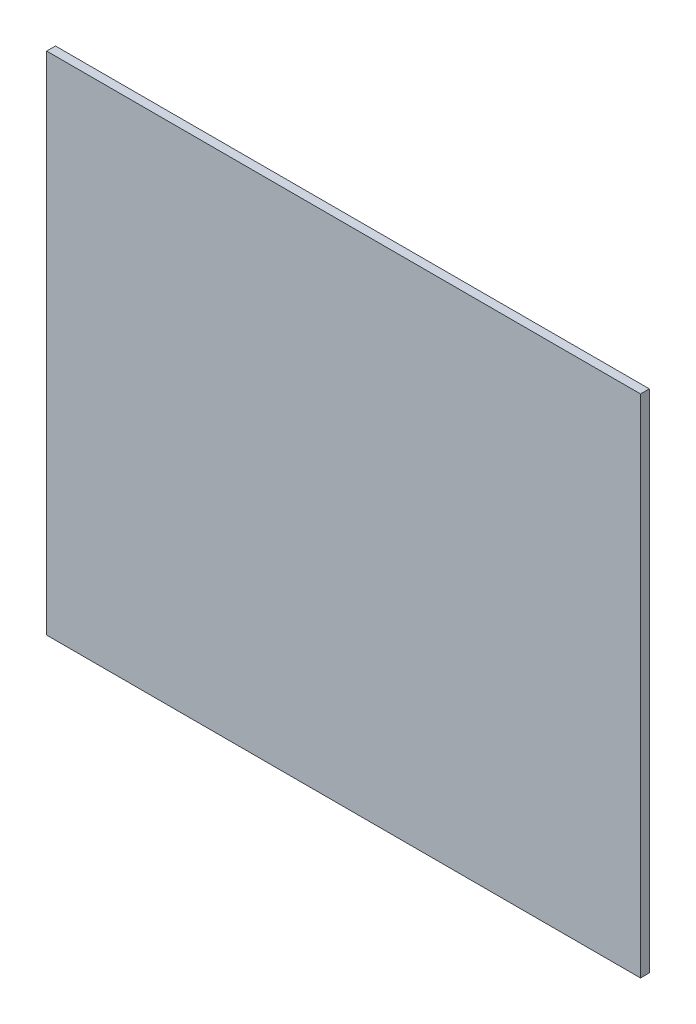
ISO-10303-21;
HEADER;
FILE_DESCRIPTION(('STEP AP214'),'2;1');
FILE_NAME('part.step','',(''),(''),'','','');
FILE_SCHEMA(('AUTOMOTIVE_DESIGN { 1 0 10303 214 1 1 1 1 }'));
ENDSEC;
DATA;
#1=APPLICATION_CONTEXT('core data for automotive mechanical design processes');
#2=APPLICATION_PROTOCOL_DEFINITION('international standard','automotive_design',2000,#1);
#3=PRODUCT_CONTEXT('',#1,'mechanical');
#4=PRODUCT('Part','Part','',(#3));
#5=PRODUCT_RELATED_PRODUCT_CATEGORY('part','',(#4));
#6=PRODUCT_DEFINITION_FORMATION('','',#4);
#7=PRODUCT_DEFINITION_CONTEXT('part definition',#1,'design');
#8=PRODUCT_DEFINITION('design','',#6,#7);
#9=PRODUCT_DEFINITION_SHAPE('','',#8);
#10=(LENGTH_UNIT() NAMED_UNIT(*) SI_UNIT(.MILLI.,.METRE.));
#11=(NAMED_UNIT(*) PLANE_ANGLE_UNIT() SI_UNIT($,.RADIAN.));
#12=(NAMED_UNIT(*) SI_UNIT($,.STERADIAN.) SOLID_ANGLE_UNIT());
#13=UNCERTAINTY_MEASURE_WITH_UNIT(LENGTH_MEASURE(1.E-05),#10,'distance_accuracy_value','');
#14=(GEOMETRIC_REPRESENTATION_CONTEXT(3) GLOBAL_UNCERTAINTY_ASSIGNED_CONTEXT((#13)) GLOBAL_UNIT_ASSIGNED_CONTEXT((#10,
#11,#12)) REPRESENTATION_CONTEXT('',''));
#15=CARTESIAN_POINT('',(0.,0.,0.));
#16=DIRECTION('',(0.,0.,1.));
#17=DIRECTION('',(1.,0.,0.));
#18=AXIS2_PLACEMENT_3D('',#15,#16,#17);
#19=CARTESIAN_POINT('',(135.,115.,4.));
#20=DIRECTION('',(-1.,0.,0.));
#21=DIRECTION('',(0.,-1.,0.));
#22=AXIS2_PLACEMENT_3D('',#19,#20,#21);
#23=PLANE('',#22);
#24=DIRECTION('',(0.,1.,0.));
#25=VECTOR('',#24,1.);
#26=CARTESIAN_POINT('',(135.,115.,0.));
#27=LINE('',#26,#25);
#28=CARTESIAN_POINT('',(135.,-115.,0.));
#29=VERTEX_POINT('',#28);
#30=CARTESIAN_POINT('',(135.,115.,0.));
#31=VERTEX_POINT('',#30);
#32=EDGE_CURVE('E96',#29,#31,#27,.T.);
#33=ORIENTED_EDGE('',*,*,#32,.T.);
#34=DIRECTION('',(0.,0.,-1.));
#35=VECTOR('',#34,1.);
#36=CARTESIAN_POINT('',(135.,115.,4.));
#37=LINE('',#36,#35);
#38=CARTESIAN_POINT('',(135.,115.,4.));
#39=VERTEX_POINT('',#38);
#40=EDGE_CURVE('E11',#39,#31,#37,.T.);
#41=ORIENTED_EDGE('',*,*,#40,.F.);
#42=DIRECTION('',(0.,1.,0.));
#43=VECTOR('',#42,1.);
#44=CARTESIAN_POINT('',(135.,115.,4.));
#45=LINE('',#44,#43);
#46=CARTESIAN_POINT('',(135.,-115.,4.));
#47=VERTEX_POINT('',#46);
#48=EDGE_CURVE('E84',#47,#39,#45,.T.);
#49=ORIENTED_EDGE('',*,*,#48,.F.);
#50=DIRECTION('',(0.,0.,-1.));
#51=VECTOR('',#50,1.);
#52=CARTESIAN_POINT('',(135.,-115.,4.));
#53=LINE('',#52,#51);
#54=EDGE_CURVE('E92',#47,#29,#53,.T.);
#55=ORIENTED_EDGE('',*,*,#54,.T.);
#56=EDGE_LOOP('',(#33,#41,#49,#55));
#57=FACE_BOUND('',#56,.T.);
#58=ADVANCED_FACE('F33',(#57),#23,.F.);
#59=CARTESIAN_POINT('',(-135.,115.,4.));
#60=DIRECTION('',(0.,-1.,0.));
#61=DIRECTION('',(0.,0.,-1.));
#62=AXIS2_PLACEMENT_3D('',#59,#60,#61);
#63=PLANE('',#62);
#64=DIRECTION('',(-1.,0.,0.));
#65=VECTOR('',#64,1.);
#66=CARTESIAN_POINT('',(-135.,115.,0.));
#67=LINE('',#66,#65);
#68=CARTESIAN_POINT('',(-135.,115.,0.));
#69=VERTEX_POINT('',#68);
#70=EDGE_CURVE('E88',#31,#69,#67,.T.);
#71=ORIENTED_EDGE('',*,*,#70,.T.);
#72=DIRECTION('',(0.,0.,-1.));
#73=VECTOR('',#72,1.);
#74=CARTESIAN_POINT('',(-135.,115.,4.));
#75=LINE('',#74,#73);
#76=CARTESIAN_POINT('',(-135.,115.,4.));
#77=VERTEX_POINT('',#76);
#78=EDGE_CURVE('E41',#77,#69,#75,.T.);
#79=ORIENTED_EDGE('',*,*,#78,.F.);
#80=DIRECTION('',(-1.,0.,0.));
#81=VECTOR('',#80,1.);
#82=CARTESIAN_POINT('',(-135.,115.,4.));
#83=LINE('',#82,#81);
#84=EDGE_CURVE('E79',#39,#77,#83,.T.);
#85=ORIENTED_EDGE('',*,*,#84,.F.);
#86=ORIENTED_EDGE('',*,*,#40,.T.);
#87=EDGE_LOOP('',(#71,#79,#85,#86));
#88=FACE_BOUND('',#87,.T.);
#89=ADVANCED_FACE('F87',(#88),#63,.F.);
#90=CARTESIAN_POINT('',(-135.,115.,4.));
#91=DIRECTION('',(1.,0.,0.));
#92=DIRECTION('',(0.,1.,0.));
#93=AXIS2_PLACEMENT_3D('',#90,#91,#92);
#94=PLANE('',#93);
#95=DIRECTION('',(0.,-1.,0.));
#96=VECTOR('',#95,1.);
#97=CARTESIAN_POINT('',(-135.,115.,0.));
#98=LINE('',#97,#96);
#99=CARTESIAN_POINT('',(-135.,-115.,0.));
#100=VERTEX_POINT('',#99);
#101=EDGE_CURVE('E66',#69,#100,#98,.T.);
#102=ORIENTED_EDGE('',*,*,#101,.T.);
#103=DIRECTION('',(0.,0.,-1.));
#104=VECTOR('',#103,1.);
#105=CARTESIAN_POINT('',(-135.,-115.,4.));
#106=LINE('',#105,#104);
#107=CARTESIAN_POINT('',(-135.,-115.,4.));
#108=VERTEX_POINT('',#107);
#109=EDGE_CURVE('E89',#108,#100,#106,.T.);
#110=ORIENTED_EDGE('',*,*,#109,.F.);
#111=DIRECTION('',(0.,-1.,0.));
#112=VECTOR('',#111,1.);
#113=CARTESIAN_POINT('',(-135.,115.,4.));
#114=LINE('',#113,#112);
#115=EDGE_CURVE('E82',#77,#108,#114,.T.);
#116=ORIENTED_EDGE('',*,*,#115,.F.);
#117=ORIENTED_EDGE('',*,*,#78,.T.);
#118=EDGE_LOOP('',(#102,#110,#116,#117));
#119=FACE_BOUND('',#118,.T.);
#120=ADVANCED_FACE('F90',(#119),#94,.F.);
#121=CARTESIAN_POINT('',(-135.,-115.,4.));
#122=DIRECTION('',(0.,1.,0.));
#123=DIRECTION('',(0.,0.,1.));
#124=AXIS2_PLACEMENT_3D('',#121,#122,#123);
#125=PLANE('',#124);
#126=DIRECTION('',(1.,0.,0.));
#127=VECTOR('',#126,1.);
#128=CARTESIAN_POINT('',(-135.,-115.,0.));
#129=LINE('',#128,#127);
#130=EDGE_CURVE('E72',#100,#29,#129,.T.);
#131=ORIENTED_EDGE('',*,*,#130,.T.);
#132=ORIENTED_EDGE('',*,*,#54,.F.);
#133=DIRECTION('',(1.,0.,0.));
#134=VECTOR('',#133,1.);
#135=CARTESIAN_POINT('',(-135.,-115.,4.));
#136=LINE('',#135,#134);
#137=EDGE_CURVE('E49',#108,#47,#136,.T.);
#138=ORIENTED_EDGE('',*,*,#137,.F.);
#139=ORIENTED_EDGE('',*,*,#109,.T.);
#140=EDGE_LOOP('',(#131,#132,#138,#139));
#141=FACE_BOUND('',#140,.T.);
#142=ADVANCED_FACE('F103',(#141),#125,.F.);
#143=CARTESIAN_POINT('',(0.,0.,4.));
#144=DIRECTION('',(0.,0.,1.));
#145=DIRECTION('',(1.,0.,0.));
#146=AXIS2_PLACEMENT_3D('',#143,#144,#145);
#147=PLANE('',#146);
#148=ORIENTED_EDGE('',*,*,#48,.T.);
#149=ORIENTED_EDGE('',*,*,#84,.T.);
#150=ORIENTED_EDGE('',*,*,#115,.T.);
#151=ORIENTED_EDGE('',*,*,#137,.T.);
#152=EDGE_LOOP('',(#148,#149,#150,#151));
#153=FACE_BOUND('',#152,.T.);
#154=ADVANCED_FACE('F80',(#153),#147,.T.);
#155=CARTESIAN_POINT('',(0.,0.,0.));
#156=DIRECTION('',(0.,0.,1.));
#157=DIRECTION('',(1.,0.,0.));
#158=AXIS2_PLACEMENT_3D('',#155,#156,#157);
#159=PLANE('',#158);
#160=ORIENTED_EDGE('',*,*,#32,.F.);
#161=ORIENTED_EDGE('',*,*,#130,.F.);
#162=ORIENTED_EDGE('',*,*,#101,.F.);
#163=ORIENTED_EDGE('',*,*,#70,.F.);
#164=EDGE_LOOP('',(#160,#161,#162,#163));
#165=FACE_BOUND('',#164,.T.);
#166=ADVANCED_FACE('F106',(#165),#159,.F.);
#167=CLOSED_SHELL('',(#58,#89,#120,#142,#154,#166));
#168=MANIFOLD_SOLID_BREP('B2',#167);
#169=ADVANCED_BREP_SHAPE_REPRESENTATION('',(#18,#168),#14);
#170=SHAPE_DEFINITION_REPRESENTATION(#9,#169);
ENDSEC;
END-ISO-10303-21;
